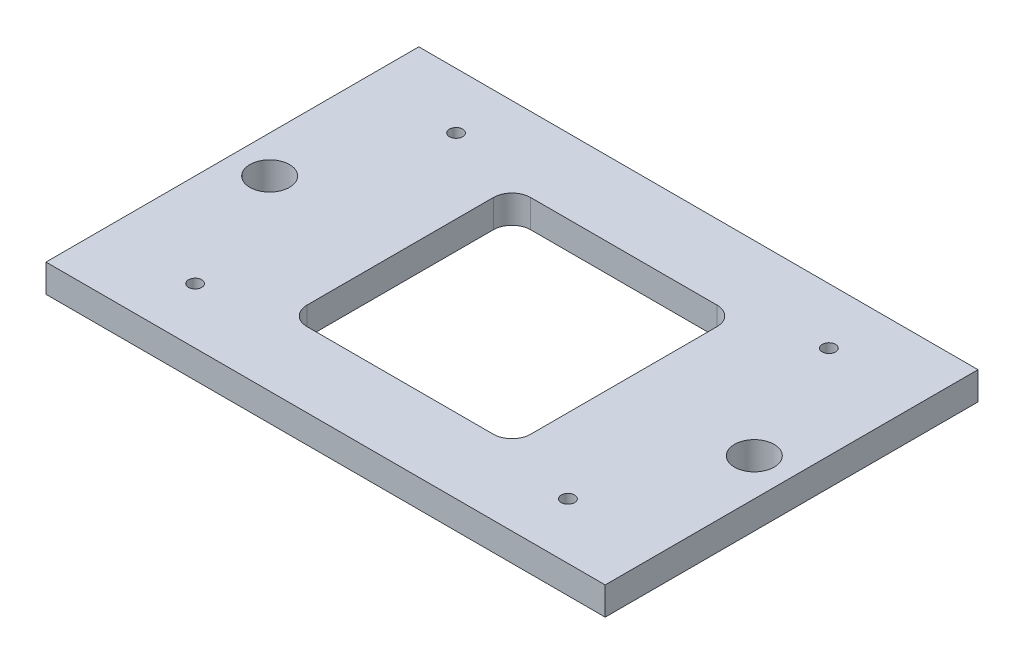
ISO-10303-21;
HEADER;
FILE_DESCRIPTION(('STEP AP214'),'2;1');
FILE_NAME('part.step','',(''),(''),'','','');
FILE_SCHEMA(('AUTOMOTIVE_DESIGN { 1 0 10303 214 1 1 1 1 }'));
ENDSEC;
DATA;
#1=APPLICATION_CONTEXT('core data for automotive mechanical design processes');
#2=APPLICATION_PROTOCOL_DEFINITION('international standard','automotive_design',2000,#1);
#3=PRODUCT_CONTEXT('',#1,'mechanical');
#4=PRODUCT('Part','Part','',(#3));
#5=PRODUCT_RELATED_PRODUCT_CATEGORY('part','',(#4));
#6=PRODUCT_DEFINITION_FORMATION('','',#4);
#7=PRODUCT_DEFINITION_CONTEXT('part definition',#1,'design');
#8=PRODUCT_DEFINITION('design','',#6,#7);
#9=PRODUCT_DEFINITION_SHAPE('','',#8);
#10=(LENGTH_UNIT() NAMED_UNIT(*) SI_UNIT(.MILLI.,.METRE.));
#11=(NAMED_UNIT(*) PLANE_ANGLE_UNIT() SI_UNIT($,.RADIAN.));
#12=(NAMED_UNIT(*) SI_UNIT($,.STERADIAN.) SOLID_ANGLE_UNIT());
#13=UNCERTAINTY_MEASURE_WITH_UNIT(LENGTH_MEASURE(1.E-05),#10,'distance_accuracy_value','');
#14=(GEOMETRIC_REPRESENTATION_CONTEXT(3) GLOBAL_UNCERTAINTY_ASSIGNED_CONTEXT((#13)) GLOBAL_UNIT_ASSIGNED_CONTEXT((#10,
#11,#12)) REPRESENTATION_CONTEXT('',''));
#15=CARTESIAN_POINT('',(0.,0.,0.));
#16=DIRECTION('',(0.,0.,1.));
#17=DIRECTION('',(1.,0.,0.));
#18=AXIS2_PLACEMENT_3D('',#15,#16,#17);
#19=CARTESIAN_POINT('',(15.875,-2.38225,15.875));
#20=DIRECTION('',(0.,1.,0.));
#21=DIRECTION('',(0.,0.,1.));
#22=AXIS2_PLACEMENT_3D('',#19,#20,#21);
#23=CYLINDRICAL_SURFACE('',#22,3.175);
#24=DIRECTION('',(0.,-1.,0.));
#25=VECTOR('',#24,1.);
#26=CARTESIAN_POINT('',(15.875,-2.38225,19.05));
#27=LINE('',#26,#25);
#28=CARTESIAN_POINT('',(15.875,2.38125,19.05));
#29=VERTEX_POINT('',#28);
#30=CARTESIAN_POINT('',(15.875,-2.38125,19.05));
#31=VERTEX_POINT('',#30);
#32=EDGE_CURVE('E180',#29,#31,#27,.T.);
#33=ORIENTED_EDGE('',*,*,#32,.F.);
#34=CARTESIAN_POINT('',(15.875,2.38125,15.875));
#35=DIRECTION('',(0.,1.,0.));
#36=DIRECTION('',(0.,0.,1.));
#37=AXIS2_PLACEMENT_3D('',#34,#35,#36);
#38=CIRCLE('',#37,3.175);
#39=CARTESIAN_POINT('',(19.05,2.38125,15.875));
#40=VERTEX_POINT('',#39);
#41=EDGE_CURVE('E41',#29,#40,#38,.T.);
#42=ORIENTED_EDGE('',*,*,#41,.T.);
#43=DIRECTION('',(0.,-1.,0.));
#44=VECTOR('',#43,1.);
#45=CARTESIAN_POINT('',(19.05,-2.38225,15.875));
#46=LINE('',#45,#44);
#47=CARTESIAN_POINT('',(19.05,-2.38125,15.875));
#48=VERTEX_POINT('',#47);
#49=EDGE_CURVE('E183',#48,#40,#46,.F.);
#50=ORIENTED_EDGE('',*,*,#49,.F.);
#51=CARTESIAN_POINT('',(15.875,-2.38125,15.875));
#52=DIRECTION('',(0.,1.,0.));
#53=DIRECTION('',(0.,0.,1.));
#54=AXIS2_PLACEMENT_3D('',#51,#52,#53);
#55=CIRCLE('',#54,3.175);
#56=EDGE_CURVE('E11',#48,#31,#55,.F.);
#57=ORIENTED_EDGE('',*,*,#56,.T.);
#58=EDGE_LOOP('',(#33,#42,#50,#57));
#59=FACE_BOUND('',#58,.T.);
#60=ADVANCED_FACE('F34',(#59),#23,.F.);
#61=CARTESIAN_POINT('',(15.875,-2.38225,-15.875));
#62=DIRECTION('',(0.,-1.,0.));
#63=DIRECTION('',(0.,0.,-1.));
#64=AXIS2_PLACEMENT_3D('',#61,#62,#63);
#65=CYLINDRICAL_SURFACE('',#64,3.175);
#66=DIRECTION('',(0.,1.,0.));
#67=VECTOR('',#66,1.);
#68=CARTESIAN_POINT('',(15.875,-2.38225,-19.05));
#69=LINE('',#68,#67);
#70=CARTESIAN_POINT('',(15.875,-2.38125,-19.05));
#71=VERTEX_POINT('',#70);
#72=CARTESIAN_POINT('',(15.875,2.38125,-19.05));
#73=VERTEX_POINT('',#72);
#74=EDGE_CURVE('E170',#71,#73,#69,.T.);
#75=ORIENTED_EDGE('',*,*,#74,.F.);
#76=CARTESIAN_POINT('',(15.875,-2.38125,-15.875));
#77=DIRECTION('',(0.,1.,0.));
#78=DIRECTION('',(0.,0.,1.));
#79=AXIS2_PLACEMENT_3D('',#76,#77,#78);
#80=CIRCLE('',#79,3.175);
#81=CARTESIAN_POINT('',(19.05,-2.38125,-15.875));
#82=VERTEX_POINT('',#81);
#83=EDGE_CURVE('E176',#71,#82,#80,.F.);
#84=ORIENTED_EDGE('',*,*,#83,.T.);
#85=DIRECTION('',(0.,1.,0.));
#86=VECTOR('',#85,1.);
#87=CARTESIAN_POINT('',(19.05,-2.38225,-15.875));
#88=LINE('',#87,#86);
#89=CARTESIAN_POINT('',(19.05,2.38125,-15.875));
#90=VERTEX_POINT('',#89);
#91=EDGE_CURVE('E173',#90,#82,#88,.F.);
#92=ORIENTED_EDGE('',*,*,#91,.F.);
#93=CARTESIAN_POINT('',(15.875,2.38125,-15.875));
#94=DIRECTION('',(0.,1.,0.));
#95=DIRECTION('',(0.,0.,1.));
#96=AXIS2_PLACEMENT_3D('',#93,#94,#95);
#97=CIRCLE('',#96,3.175);
#98=EDGE_CURVE('E178',#90,#73,#97,.T.);
#99=ORIENTED_EDGE('',*,*,#98,.T.);
#100=EDGE_LOOP('',(#75,#84,#92,#99));
#101=FACE_BOUND('',#100,.T.);
#102=ADVANCED_FACE('F239',(#101),#65,.F.);
#103=CARTESIAN_POINT('',(-15.875,-2.38225,15.875));
#104=DIRECTION('',(0.,1.,0.));
#105=DIRECTION('',(0.,0.,1.));
#106=AXIS2_PLACEMENT_3D('',#103,#104,#105);
#107=CYLINDRICAL_SURFACE('',#106,3.175);
#108=DIRECTION('',(0.,-1.,0.));
#109=VECTOR('',#108,1.);
#110=CARTESIAN_POINT('',(-19.05,-2.38225,15.875));
#111=LINE('',#110,#109);
#112=CARTESIAN_POINT('',(-19.05,2.38125,15.875));
#113=VERTEX_POINT('',#112);
#114=CARTESIAN_POINT('',(-19.05,-2.38125,15.875));
#115=VERTEX_POINT('',#114);
#116=EDGE_CURVE('E160',#113,#115,#111,.T.);
#117=ORIENTED_EDGE('',*,*,#116,.F.);
#118=CARTESIAN_POINT('',(-15.875,2.38125,15.875));
#119=DIRECTION('',(0.,1.,0.));
#120=DIRECTION('',(0.,0.,1.));
#121=AXIS2_PLACEMENT_3D('',#118,#119,#120);
#122=CIRCLE('',#121,3.175);
#123=CARTESIAN_POINT('',(-15.875,2.38125,19.05));
#124=VERTEX_POINT('',#123);
#125=EDGE_CURVE('E166',#113,#124,#122,.T.);
#126=ORIENTED_EDGE('',*,*,#125,.T.);
#127=DIRECTION('',(0.,-1.,0.));
#128=VECTOR('',#127,1.);
#129=CARTESIAN_POINT('',(-15.875,-2.38225,19.05));
#130=LINE('',#129,#128);
#131=CARTESIAN_POINT('',(-15.875,-2.38125,19.05));
#132=VERTEX_POINT('',#131);
#133=EDGE_CURVE('E163',#132,#124,#130,.F.);
#134=ORIENTED_EDGE('',*,*,#133,.F.);
#135=CARTESIAN_POINT('',(-15.875,-2.38125,15.875));
#136=DIRECTION('',(0.,1.,0.));
#137=DIRECTION('',(0.,0.,1.));
#138=AXIS2_PLACEMENT_3D('',#135,#136,#137);
#139=CIRCLE('',#138,3.175);
#140=EDGE_CURVE('E168',#132,#115,#139,.F.);
#141=ORIENTED_EDGE('',*,*,#140,.T.);
#142=EDGE_LOOP('',(#117,#126,#134,#141));
#143=FACE_BOUND('',#142,.T.);
#144=ADVANCED_FACE('F243',(#143),#107,.F.);
#145=CARTESIAN_POINT('',(-15.875,-2.38225,-15.875));
#146=DIRECTION('',(0.,-1.,0.));
#147=DIRECTION('',(0.,0.,-1.));
#148=AXIS2_PLACEMENT_3D('',#145,#146,#147);
#149=CYLINDRICAL_SURFACE('',#148,3.175);
#150=DIRECTION('',(0.,1.,0.));
#151=VECTOR('',#150,1.);
#152=CARTESIAN_POINT('',(-19.05,-2.38225,-15.875));
#153=LINE('',#152,#151);
#154=CARTESIAN_POINT('',(-19.05,-2.38125,-15.875));
#155=VERTEX_POINT('',#154);
#156=CARTESIAN_POINT('',(-19.05,2.38125,-15.875));
#157=VERTEX_POINT('',#156);
#158=EDGE_CURVE('E145',#155,#157,#153,.T.);
#159=ORIENTED_EDGE('',*,*,#158,.F.);
#160=CARTESIAN_POINT('',(-15.875,-2.38125,-15.875));
#161=DIRECTION('',(0.,1.,0.));
#162=DIRECTION('',(0.,0.,1.));
#163=AXIS2_PLACEMENT_3D('',#160,#161,#162);
#164=CIRCLE('',#163,3.175);
#165=CARTESIAN_POINT('',(-15.875,-2.38125,-19.05));
#166=VERTEX_POINT('',#165);
#167=EDGE_CURVE('E156',#155,#166,#164,.F.);
#168=ORIENTED_EDGE('',*,*,#167,.T.);
#169=DIRECTION('',(0.,1.,0.));
#170=VECTOR('',#169,1.);
#171=CARTESIAN_POINT('',(-15.875,-2.38225,-19.05));
#172=LINE('',#171,#170);
#173=CARTESIAN_POINT('',(-15.875,2.38125,-19.05));
#174=VERTEX_POINT('',#173);
#175=EDGE_CURVE('E148',#174,#166,#172,.F.);
#176=ORIENTED_EDGE('',*,*,#175,.F.);
#177=CARTESIAN_POINT('',(-15.875,2.38125,-15.875));
#178=DIRECTION('',(0.,1.,0.));
#179=DIRECTION('',(0.,0.,1.));
#180=AXIS2_PLACEMENT_3D('',#177,#178,#179);
#181=CIRCLE('',#180,3.175);
#182=EDGE_CURVE('E158',#174,#157,#181,.T.);
#183=ORIENTED_EDGE('',*,*,#182,.T.);
#184=EDGE_LOOP('',(#159,#168,#176,#183));
#185=FACE_BOUND('',#184,.T.);
#186=ADVANCED_FACE('F260',(#185),#149,.F.);
#187=CARTESIAN_POINT('',(47.625,2.38125,-31.75));
#188=DIRECTION('',(-1.,0.,0.));
#189=DIRECTION('',(0.,0.,1.));
#190=AXIS2_PLACEMENT_3D('',#187,#188,#189);
#191=PLANE('',#190);
#192=DIRECTION('',(0.,0.,-1.));
#193=VECTOR('',#192,1.);
#194=CARTESIAN_POINT('',(47.625,-2.38125,-31.75));
#195=LINE('',#194,#193);
#196=CARTESIAN_POINT('',(47.625,-2.38125,31.75));
#197=VERTEX_POINT('',#196);
#198=CARTESIAN_POINT('',(47.625,-2.38125,-31.75));
#199=VERTEX_POINT('',#198);
#200=EDGE_CURVE('E144',#197,#199,#195,.T.);
#201=ORIENTED_EDGE('',*,*,#200,.T.);
#202=DIRECTION('',(0.,-1.,0.));
#203=VECTOR('',#202,1.);
#204=CARTESIAN_POINT('',(47.625,2.38125,-31.75));
#205=LINE('',#204,#203);
#206=CARTESIAN_POINT('',(47.625,2.38125,-31.75));
#207=VERTEX_POINT('',#206);
#208=EDGE_CURVE('E124',#207,#199,#205,.T.);
#209=ORIENTED_EDGE('',*,*,#208,.F.);
#210=DIRECTION('',(0.,0.,-1.));
#211=VECTOR('',#210,1.);
#212=CARTESIAN_POINT('',(47.625,2.38125,-31.75));
#213=LINE('',#212,#211);
#214=CARTESIAN_POINT('',(47.625,2.38125,31.75));
#215=VERTEX_POINT('',#214);
#216=EDGE_CURVE('E131',#215,#207,#213,.T.);
#217=ORIENTED_EDGE('',*,*,#216,.F.);
#218=DIRECTION('',(0.,-1.,0.));
#219=VECTOR('',#218,1.);
#220=CARTESIAN_POINT('',(47.625,2.38125,31.75));
#221=LINE('',#220,#219);
#222=EDGE_CURVE('E213',#215,#197,#221,.T.);
#223=ORIENTED_EDGE('',*,*,#222,.T.);
#224=EDGE_LOOP('',(#201,#209,#217,#223));
#225=FACE_BOUND('',#224,.T.);
#226=ADVANCED_FACE('F142',(#225),#191,.F.);
#227=CARTESIAN_POINT('',(-47.625,2.38125,-31.75));
#228=DIRECTION('',(0.,0.,1.));
#229=DIRECTION('',(1.,0.,0.));
#230=AXIS2_PLACEMENT_3D('',#227,#228,#229);
#231=PLANE('',#230);
#232=DIRECTION('',(-1.,0.,0.));
#233=VECTOR('',#232,1.);
#234=CARTESIAN_POINT('',(-47.625,-2.38125,-31.75));
#235=LINE('',#234,#233);
#236=CARTESIAN_POINT('',(-47.625,-2.38125,-31.75));
#237=VERTEX_POINT('',#236);
#238=EDGE_CURVE('E215',#199,#237,#235,.T.);
#239=ORIENTED_EDGE('',*,*,#238,.T.);
#240=DIRECTION('',(0.,-1.,0.));
#241=VECTOR('',#240,1.);
#242=CARTESIAN_POINT('',(-47.625,2.38125,-31.75));
#243=LINE('',#242,#241);
#244=CARTESIAN_POINT('',(-47.625,2.38125,-31.75));
#245=VERTEX_POINT('',#244);
#246=EDGE_CURVE('E127',#245,#237,#243,.T.);
#247=ORIENTED_EDGE('',*,*,#246,.F.);
#248=DIRECTION('',(-1.,0.,0.));
#249=VECTOR('',#248,1.);
#250=CARTESIAN_POINT('',(-47.625,2.38125,-31.75));
#251=LINE('',#250,#249);
#252=EDGE_CURVE('E120',#207,#245,#251,.T.);
#253=ORIENTED_EDGE('',*,*,#252,.F.);
#254=ORIENTED_EDGE('',*,*,#208,.T.);
#255=EDGE_LOOP('',(#239,#247,#253,#254));
#256=FACE_BOUND('',#255,.T.);
#257=ADVANCED_FACE('F122',(#256),#231,.F.);
#258=CARTESIAN_POINT('',(-47.625,2.38125,-31.75));
#259=DIRECTION('',(1.,0.,0.));
#260=DIRECTION('',(0.,0.,-1.));
#261=AXIS2_PLACEMENT_3D('',#258,#259,#260);
#262=PLANE('',#261);
#263=DIRECTION('',(0.,0.,1.));
#264=VECTOR('',#263,1.);
#265=CARTESIAN_POINT('',(-47.625,-2.38125,-31.75));
#266=LINE('',#265,#264);
#267=CARTESIAN_POINT('',(-47.625,-2.38125,31.75));
#268=VERTEX_POINT('',#267);
#269=EDGE_CURVE('E217',#237,#268,#266,.T.);
#270=ORIENTED_EDGE('',*,*,#269,.T.);
#271=DIRECTION('',(0.,-1.,0.));
#272=VECTOR('',#271,1.);
#273=CARTESIAN_POINT('',(-47.625,2.38125,31.75));
#274=LINE('',#273,#272);
#275=CARTESIAN_POINT('',(-47.625,2.38125,31.75));
#276=VERTEX_POINT('',#275);
#277=EDGE_CURVE('E150',#276,#268,#274,.T.);
#278=ORIENTED_EDGE('',*,*,#277,.F.);
#279=DIRECTION('',(0.,0.,1.));
#280=VECTOR('',#279,1.);
#281=CARTESIAN_POINT('',(-47.625,2.38125,-31.75));
#282=LINE('',#281,#280);
#283=EDGE_CURVE('E130',#245,#276,#282,.T.);
#284=ORIENTED_EDGE('',*,*,#283,.F.);
#285=ORIENTED_EDGE('',*,*,#246,.T.);
#286=EDGE_LOOP('',(#270,#278,#284,#285));
#287=FACE_BOUND('',#286,.T.);
#288=ADVANCED_FACE('F229',(#287),#262,.F.);
#289=CARTESIAN_POINT('',(-47.625,2.38125,31.75));
#290=DIRECTION('',(0.,0.,-1.));
#291=DIRECTION('',(-1.,0.,0.));
#292=AXIS2_PLACEMENT_3D('',#289,#290,#291);
#293=PLANE('',#292);
#294=DIRECTION('',(1.,0.,0.));
#295=VECTOR('',#294,1.);
#296=CARTESIAN_POINT('',(-47.625,-2.38125,31.75));
#297=LINE('',#296,#295);
#298=EDGE_CURVE('E140',#268,#197,#297,.T.);
#299=ORIENTED_EDGE('',*,*,#298,.T.);
#300=ORIENTED_EDGE('',*,*,#222,.F.);
#301=DIRECTION('',(1.,0.,0.));
#302=VECTOR('',#301,1.);
#303=CARTESIAN_POINT('',(-47.625,2.38125,31.75));
#304=LINE('',#303,#302);
#305=EDGE_CURVE('E136',#276,#215,#304,.T.);
#306=ORIENTED_EDGE('',*,*,#305,.F.);
#307=ORIENTED_EDGE('',*,*,#277,.T.);
#308=EDGE_LOOP('',(#299,#300,#306,#307));
#309=FACE_BOUND('',#308,.T.);
#310=ADVANCED_FACE('F224',(#309),#293,.F.);
#311=CARTESIAN_POINT('',(0.,2.38125,0.));
#312=DIRECTION('',(0.,1.,0.));
#313=DIRECTION('',(0.,0.,1.));
#314=AXIS2_PLACEMENT_3D('',#311,#312,#313);
#315=PLANE('',#314);
#316=CARTESIAN_POINT('',(-41.275,2.38125,0.));
#317=DIRECTION('',(0.,1.,0.));
#318=DIRECTION('',(0.,0.,1.));
#319=AXIS2_PLACEMENT_3D('',#316,#317,#318);
#320=CIRCLE('',#319,3.37350099999999);
#321=CARTESIAN_POINT('',(-41.275,2.38125,3.37350099999999));
#322=VERTEX_POINT('',#321);
#323=EDGE_CURVE('E301',#322,#322,#320,.T.);
#324=ORIENTED_EDGE('',*,*,#323,.F.);
#325=EDGE_LOOP('',(#324));
#326=FACE_BOUND('',#325,.T.);
#327=CARTESIAN_POINT('',(41.275,2.38125,0.));
#328=DIRECTION('',(0.,1.,0.));
#329=DIRECTION('',(0.,0.,1.));
#330=AXIS2_PLACEMENT_3D('',#327,#328,#329);
#331=CIRCLE('',#330,3.37350099999999);
#332=CARTESIAN_POINT('',(41.275,2.38125,3.37350099999999));
#333=VERTEX_POINT('',#332);
#334=EDGE_CURVE('E295',#333,#333,#331,.T.);
#335=ORIENTED_EDGE('',*,*,#334,.F.);
#336=EDGE_LOOP('',(#335));
#337=FACE_BOUND('',#336,.T.);
#338=CARTESIAN_POINT('',(-31.75,2.38125,22.225));
#339=DIRECTION('',(0.,1.,0.));
#340=DIRECTION('',(0.,0.,1.));
#341=AXIS2_PLACEMENT_3D('',#338,#339,#340);
#342=CIRCLE('',#341,1.1303);
#343=CARTESIAN_POINT('',(-31.75,2.38125,23.3553));
#344=VERTEX_POINT('',#343);
#345=EDGE_CURVE('E289',#344,#344,#342,.T.);
#346=ORIENTED_EDGE('',*,*,#345,.F.);
#347=EDGE_LOOP('',(#346));
#348=FACE_BOUND('',#347,.T.);
#349=CARTESIAN_POINT('',(31.75,2.38125,22.225));
#350=DIRECTION('',(0.,1.,0.));
#351=DIRECTION('',(0.,0.,1.));
#352=AXIS2_PLACEMENT_3D('',#349,#350,#351);
#353=CIRCLE('',#352,1.1303);
#354=CARTESIAN_POINT('',(31.75,2.38125,23.3553));
#355=VERTEX_POINT('',#354);
#356=EDGE_CURVE('E283',#355,#355,#353,.T.);
#357=ORIENTED_EDGE('',*,*,#356,.F.);
#358=EDGE_LOOP('',(#357));
#359=FACE_BOUND('',#358,.T.);
#360=CARTESIAN_POINT('',(-31.75,2.38125,-22.225));
#361=DIRECTION('',(0.,1.,0.));
#362=DIRECTION('',(0.,0.,1.));
#363=AXIS2_PLACEMENT_3D('',#360,#361,#362);
#364=CIRCLE('',#363,1.1303);
#365=CARTESIAN_POINT('',(-31.75,2.38125,-21.0947));
#366=VERTEX_POINT('',#365);
#367=EDGE_CURVE('E277',#366,#366,#364,.T.);
#368=ORIENTED_EDGE('',*,*,#367,.F.);
#369=EDGE_LOOP('',(#368));
#370=FACE_BOUND('',#369,.T.);
#371=CARTESIAN_POINT('',(31.75,2.38125,-22.225));
#372=DIRECTION('',(0.,1.,0.));
#373=DIRECTION('',(0.,0.,1.));
#374=AXIS2_PLACEMENT_3D('',#371,#372,#373);
#375=CIRCLE('',#374,1.1303);
#376=CARTESIAN_POINT('',(31.75,2.38125,-21.0947));
#377=VERTEX_POINT('',#376);
#378=EDGE_CURVE('E269',#377,#377,#375,.T.);
#379=ORIENTED_EDGE('',*,*,#378,.F.);
#380=EDGE_LOOP('',(#379));
#381=FACE_BOUND('',#380,.T.);
#382=DIRECTION('',(0.,0.,-1.));
#383=VECTOR('',#382,1.);
#384=CARTESIAN_POINT('',(19.05,2.38125,-19.05));
#385=LINE('',#384,#383);
#386=EDGE_CURVE('E188',#40,#90,#385,.T.);
#387=ORIENTED_EDGE('',*,*,#386,.F.);
#388=ORIENTED_EDGE('',*,*,#41,.F.);
#389=DIRECTION('',(1.,0.,0.));
#390=VECTOR('',#389,1.);
#391=CARTESIAN_POINT('',(-19.05,2.38125,19.05));
#392=LINE('',#391,#390);
#393=EDGE_CURVE('E205',#124,#29,#392,.T.);
#394=ORIENTED_EDGE('',*,*,#393,.F.);
#395=ORIENTED_EDGE('',*,*,#125,.F.);
#396=DIRECTION('',(0.,0.,1.));
#397=VECTOR('',#396,1.);
#398=CARTESIAN_POINT('',(-19.05,2.38125,-19.05));
#399=LINE('',#398,#397);
#400=EDGE_CURVE('E197',#157,#113,#399,.T.);
#401=ORIENTED_EDGE('',*,*,#400,.F.);
#402=ORIENTED_EDGE('',*,*,#182,.F.);
#403=DIRECTION('',(-1.,0.,0.));
#404=VECTOR('',#403,1.);
#405=CARTESIAN_POINT('',(-19.05,2.38125,-19.05));
#406=LINE('',#405,#404);
#407=EDGE_CURVE('E195',#73,#174,#406,.T.);
#408=ORIENTED_EDGE('',*,*,#407,.F.);
#409=ORIENTED_EDGE('',*,*,#98,.F.);
#410=EDGE_LOOP('',(#387,#388,#394,#395,#401,#402,#408,#409));
#411=FACE_BOUND('',#410,.T.);
#412=ORIENTED_EDGE('',*,*,#216,.T.);
#413=ORIENTED_EDGE('',*,*,#252,.T.);
#414=ORIENTED_EDGE('',*,*,#283,.T.);
#415=ORIENTED_EDGE('',*,*,#305,.T.);
#416=EDGE_LOOP('',(#412,#413,#414,#415));
#417=FACE_BOUND('',#416,.T.);
#418=ADVANCED_FACE('F134',(#326,#337,#348,#359,#370,#381,#411,#417),#315,.T.);
#419=CARTESIAN_POINT('',(0.,-2.38125,0.));
#420=DIRECTION('',(0.,1.,0.));
#421=DIRECTION('',(0.,0.,1.));
#422=AXIS2_PLACEMENT_3D('',#419,#420,#421);
#423=PLANE('',#422);
#424=CARTESIAN_POINT('',(-41.275,-2.38125,0.));
#425=DIRECTION('',(0.,1.,0.));
#426=DIRECTION('',(0.,0.,1.));
#427=AXIS2_PLACEMENT_3D('',#424,#425,#426);
#428=CIRCLE('',#427,3.373501);
#429=CARTESIAN_POINT('',(-41.275,-2.38125,3.373501));
#430=VERTEX_POINT('',#429);
#431=EDGE_CURVE('E298',#430,#430,#428,.T.);
#432=ORIENTED_EDGE('',*,*,#431,.T.);
#433=EDGE_LOOP('',(#432));
#434=FACE_BOUND('',#433,.T.);
#435=CARTESIAN_POINT('',(41.275,-2.38125,0.));
#436=DIRECTION('',(0.,1.,0.));
#437=DIRECTION('',(0.,0.,1.));
#438=AXIS2_PLACEMENT_3D('',#435,#436,#437);
#439=CIRCLE('',#438,3.373501);
#440=CARTESIAN_POINT('',(41.275,-2.38125,3.373501));
#441=VERTEX_POINT('',#440);
#442=EDGE_CURVE('E292',#441,#441,#439,.T.);
#443=ORIENTED_EDGE('',*,*,#442,.T.);
#444=EDGE_LOOP('',(#443));
#445=FACE_BOUND('',#444,.T.);
#446=CARTESIAN_POINT('',(-31.75,-2.38125,22.225));
#447=DIRECTION('',(0.,1.,0.));
#448=DIRECTION('',(0.,0.,1.));
#449=AXIS2_PLACEMENT_3D('',#446,#447,#448);
#450=CIRCLE('',#449,1.1303);
#451=CARTESIAN_POINT('',(-31.75,-2.38125,23.3553));
#452=VERTEX_POINT('',#451);
#453=EDGE_CURVE('E286',#452,#452,#450,.T.);
#454=ORIENTED_EDGE('',*,*,#453,.T.);
#455=EDGE_LOOP('',(#454));
#456=FACE_BOUND('',#455,.T.);
#457=CARTESIAN_POINT('',(31.75,-2.38125,22.225));
#458=DIRECTION('',(0.,1.,0.));
#459=DIRECTION('',(0.,0.,1.));
#460=AXIS2_PLACEMENT_3D('',#457,#458,#459);
#461=CIRCLE('',#460,1.1303);
#462=CARTESIAN_POINT('',(31.75,-2.38125,23.3553));
#463=VERTEX_POINT('',#462);
#464=EDGE_CURVE('E280',#463,#463,#461,.T.);
#465=ORIENTED_EDGE('',*,*,#464,.T.);
#466=EDGE_LOOP('',(#465));
#467=FACE_BOUND('',#466,.T.);
#468=CARTESIAN_POINT('',(-31.75,-2.38125,-22.225));
#469=DIRECTION('',(0.,1.,0.));
#470=DIRECTION('',(0.,0.,1.));
#471=AXIS2_PLACEMENT_3D('',#468,#469,#470);
#472=CIRCLE('',#471,1.1303);
#473=CARTESIAN_POINT('',(-31.75,-2.38125,-21.0947));
#474=VERTEX_POINT('',#473);
#475=EDGE_CURVE('E274',#474,#474,#472,.T.);
#476=ORIENTED_EDGE('',*,*,#475,.T.);
#477=EDGE_LOOP('',(#476));
#478=FACE_BOUND('',#477,.T.);
#479=CARTESIAN_POINT('',(31.75,-2.38125,-22.225));
#480=DIRECTION('',(0.,1.,0.));
#481=DIRECTION('',(0.,0.,1.));
#482=AXIS2_PLACEMENT_3D('',#479,#480,#481);
#483=CIRCLE('',#482,1.1303);
#484=CARTESIAN_POINT('',(31.75,-2.38125,-21.0947));
#485=VERTEX_POINT('',#484);
#486=EDGE_CURVE('E266',#485,#485,#483,.T.);
#487=ORIENTED_EDGE('',*,*,#486,.T.);
#488=EDGE_LOOP('',(#487));
#489=FACE_BOUND('',#488,.T.);
#490=DIRECTION('',(-1.,0.,0.));
#491=VECTOR('',#490,1.);
#492=CARTESIAN_POINT('',(-19.05,-2.38125,19.05));
#493=LINE('',#492,#491);
#494=EDGE_CURVE('E199',#31,#132,#493,.T.);
#495=ORIENTED_EDGE('',*,*,#494,.F.);
#496=ORIENTED_EDGE('',*,*,#56,.F.);
#497=DIRECTION('',(0.,0.,1.));
#498=VECTOR('',#497,1.);
#499=CARTESIAN_POINT('',(19.05,-2.38125,-19.05));
#500=LINE('',#499,#498);
#501=EDGE_CURVE('E190',#82,#48,#500,.T.);
#502=ORIENTED_EDGE('',*,*,#501,.F.);
#503=ORIENTED_EDGE('',*,*,#83,.F.);
#504=DIRECTION('',(1.,0.,0.));
#505=VECTOR('',#504,1.);
#506=CARTESIAN_POINT('',(-19.05,-2.38125,-19.05));
#507=LINE('',#506,#505);
#508=EDGE_CURVE('E208',#166,#71,#507,.T.);
#509=ORIENTED_EDGE('',*,*,#508,.F.);
#510=ORIENTED_EDGE('',*,*,#167,.F.);
#511=DIRECTION('',(0.,0.,-1.));
#512=VECTOR('',#511,1.);
#513=CARTESIAN_POINT('',(-19.05,-2.38125,-19.05));
#514=LINE('',#513,#512);
#515=EDGE_CURVE('E257',#115,#155,#514,.T.);
#516=ORIENTED_EDGE('',*,*,#515,.F.);
#517=ORIENTED_EDGE('',*,*,#140,.F.);
#518=EDGE_LOOP('',(#495,#496,#502,#503,#509,#510,#516,#517));
#519=FACE_BOUND('',#518,.T.);
#520=ORIENTED_EDGE('',*,*,#200,.F.);
#521=ORIENTED_EDGE('',*,*,#298,.F.);
#522=ORIENTED_EDGE('',*,*,#269,.F.);
#523=ORIENTED_EDGE('',*,*,#238,.F.);
#524=EDGE_LOOP('',(#520,#521,#522,#523));
#525=FACE_BOUND('',#524,.T.);
#526=ADVANCED_FACE('F228',(#434,#445,#456,#467,#478,#489,#519,#525),#423,.F.);
#527=CARTESIAN_POINT('',(19.05,-2.38225,-19.05));
#528=DIRECTION('',(1.,0.,0.));
#529=DIRECTION('',(0.,0.,-1.));
#530=AXIS2_PLACEMENT_3D('',#527,#528,#529);
#531=PLANE('',#530);
#532=ORIENTED_EDGE('',*,*,#501,.T.);
#533=ORIENTED_EDGE('',*,*,#49,.T.);
#534=ORIENTED_EDGE('',*,*,#386,.T.);
#535=ORIENTED_EDGE('',*,*,#91,.T.);
#536=EDGE_LOOP('',(#532,#533,#534,#535));
#537=FACE_BOUND('',#536,.T.);
#538=ADVANCED_FACE('F187',(#537),#531,.F.);
#539=CARTESIAN_POINT('',(-19.05,-2.38225,19.05));
#540=DIRECTION('',(0.,0.,1.));
#541=DIRECTION('',(1.,0.,0.));
#542=AXIS2_PLACEMENT_3D('',#539,#540,#541);
#543=PLANE('',#542);
#544=ORIENTED_EDGE('',*,*,#393,.T.);
#545=ORIENTED_EDGE('',*,*,#32,.T.);
#546=ORIENTED_EDGE('',*,*,#494,.T.);
#547=ORIENTED_EDGE('',*,*,#133,.T.);
#548=EDGE_LOOP('',(#544,#545,#546,#547));
#549=FACE_BOUND('',#548,.T.);
#550=ADVANCED_FACE('F246',(#549),#543,.F.);
#551=CARTESIAN_POINT('',(-19.05,-2.38225,-19.05));
#552=DIRECTION('',(-1.,0.,0.));
#553=DIRECTION('',(0.,0.,1.));
#554=AXIS2_PLACEMENT_3D('',#551,#552,#553);
#555=PLANE('',#554);
#556=ORIENTED_EDGE('',*,*,#400,.T.);
#557=ORIENTED_EDGE('',*,*,#116,.T.);
#558=ORIENTED_EDGE('',*,*,#515,.T.);
#559=ORIENTED_EDGE('',*,*,#158,.T.);
#560=EDGE_LOOP('',(#556,#557,#558,#559));
#561=FACE_BOUND('',#560,.T.);
#562=ADVANCED_FACE('F255',(#561),#555,.F.);
#563=CARTESIAN_POINT('',(-19.05,-2.38225,-19.05));
#564=DIRECTION('',(0.,0.,-1.));
#565=DIRECTION('',(-1.,0.,0.));
#566=AXIS2_PLACEMENT_3D('',#563,#564,#565);
#567=PLANE('',#566);
#568=ORIENTED_EDGE('',*,*,#508,.T.);
#569=ORIENTED_EDGE('',*,*,#74,.T.);
#570=ORIENTED_EDGE('',*,*,#407,.T.);
#571=ORIENTED_EDGE('',*,*,#175,.T.);
#572=EDGE_LOOP('',(#568,#569,#570,#571));
#573=FACE_BOUND('',#572,.T.);
#574=ADVANCED_FACE('F263',(#573),#567,.F.);
#575=CARTESIAN_POINT('',(31.75,2.38125,-22.225));
#576=DIRECTION('',(0.,1.,0.));
#577=DIRECTION('',(0.,0.,1.));
#578=AXIS2_PLACEMENT_3D('',#575,#576,#577);
#579=CYLINDRICAL_SURFACE('',#578,1.1303);
#580=ORIENTED_EDGE('',*,*,#486,.F.);
#581=EDGE_LOOP('',(#580));
#582=FACE_BOUND('',#581,.T.);
#583=ORIENTED_EDGE('',*,*,#378,.T.);
#584=EDGE_LOOP('',(#583));
#585=FACE_BOUND('',#584,.T.);
#586=ADVANCED_FACE('F320',(#582,#585),#579,.F.);
#587=CARTESIAN_POINT('',(-31.75,2.38125,-22.225));
#588=DIRECTION('',(0.,1.,0.));
#589=DIRECTION('',(0.,0.,1.));
#590=AXIS2_PLACEMENT_3D('',#587,#588,#589);
#591=CYLINDRICAL_SURFACE('',#590,1.1303);
#592=ORIENTED_EDGE('',*,*,#475,.F.);
#593=EDGE_LOOP('',(#592));
#594=FACE_BOUND('',#593,.T.);
#595=ORIENTED_EDGE('',*,*,#367,.T.);
#596=EDGE_LOOP('',(#595));
#597=FACE_BOUND('',#596,.T.);
#598=ADVANCED_FACE('F322',(#594,#597),#591,.F.);
#599=CARTESIAN_POINT('',(31.75,2.38125,22.225));
#600=DIRECTION('',(0.,1.,0.));
#601=DIRECTION('',(0.,0.,1.));
#602=AXIS2_PLACEMENT_3D('',#599,#600,#601);
#603=CYLINDRICAL_SURFACE('',#602,1.1303);
#604=ORIENTED_EDGE('',*,*,#464,.F.);
#605=EDGE_LOOP('',(#604));
#606=FACE_BOUND('',#605,.T.);
#607=ORIENTED_EDGE('',*,*,#356,.T.);
#608=EDGE_LOOP('',(#607));
#609=FACE_BOUND('',#608,.T.);
#610=ADVANCED_FACE('F329',(#606,#609),#603,.F.);
#611=CARTESIAN_POINT('',(-31.75,2.38125,22.225));
#612=DIRECTION('',(0.,1.,0.));
#613=DIRECTION('',(0.,0.,1.));
#614=AXIS2_PLACEMENT_3D('',#611,#612,#613);
#615=CYLINDRICAL_SURFACE('',#614,1.1303);
#616=ORIENTED_EDGE('',*,*,#453,.F.);
#617=EDGE_LOOP('',(#616));
#618=FACE_BOUND('',#617,.T.);
#619=ORIENTED_EDGE('',*,*,#345,.T.);
#620=EDGE_LOOP('',(#619));
#621=FACE_BOUND('',#620,.T.);
#622=ADVANCED_FACE('F360',(#618,#621),#615,.F.);
#623=CARTESIAN_POINT('',(41.275,2.38125,0.));
#624=DIRECTION('',(0.,1.,0.));
#625=DIRECTION('',(0.,0.,1.));
#626=AXIS2_PLACEMENT_3D('',#623,#624,#625);
#627=CYLINDRICAL_SURFACE('',#626,3.373501);
#628=ORIENTED_EDGE('',*,*,#442,.F.);
#629=EDGE_LOOP('',(#628));
#630=FACE_BOUND('',#629,.T.);
#631=ORIENTED_EDGE('',*,*,#334,.T.);
#632=EDGE_LOOP('',(#631));
#633=FACE_BOUND('',#632,.T.);
#634=ADVANCED_FACE('F364',(#630,#633),#627,.F.);
#635=CARTESIAN_POINT('',(-41.275,2.38125,0.));
#636=DIRECTION('',(0.,1.,0.));
#637=DIRECTION('',(0.,0.,1.));
#638=AXIS2_PLACEMENT_3D('',#635,#636,#637);
#639=CYLINDRICAL_SURFACE('',#638,3.373501);
#640=ORIENTED_EDGE('',*,*,#431,.F.);
#641=EDGE_LOOP('',(#640));
#642=FACE_BOUND('',#641,.T.);
#643=ORIENTED_EDGE('',*,*,#323,.T.);
#644=EDGE_LOOP('',(#643));
#645=FACE_BOUND('',#644,.T.);
#646=ADVANCED_FACE('F305',(#642,#645),#639,.F.);
#647=CLOSED_SHELL('',(#60,#102,#144,#186,#226,#257,#288,#310,#418,#526,#538,#550,#562,#574,#586,
#598,#610,#622,#634,#646));
#648=MANIFOLD_SOLID_BREP('B2',#647);
#649=ADVANCED_BREP_SHAPE_REPRESENTATION('',(#18,#648),#14);
#650=SHAPE_DEFINITION_REPRESENTATION(#9,#649);
ENDSEC;
END-ISO-10303-21;
